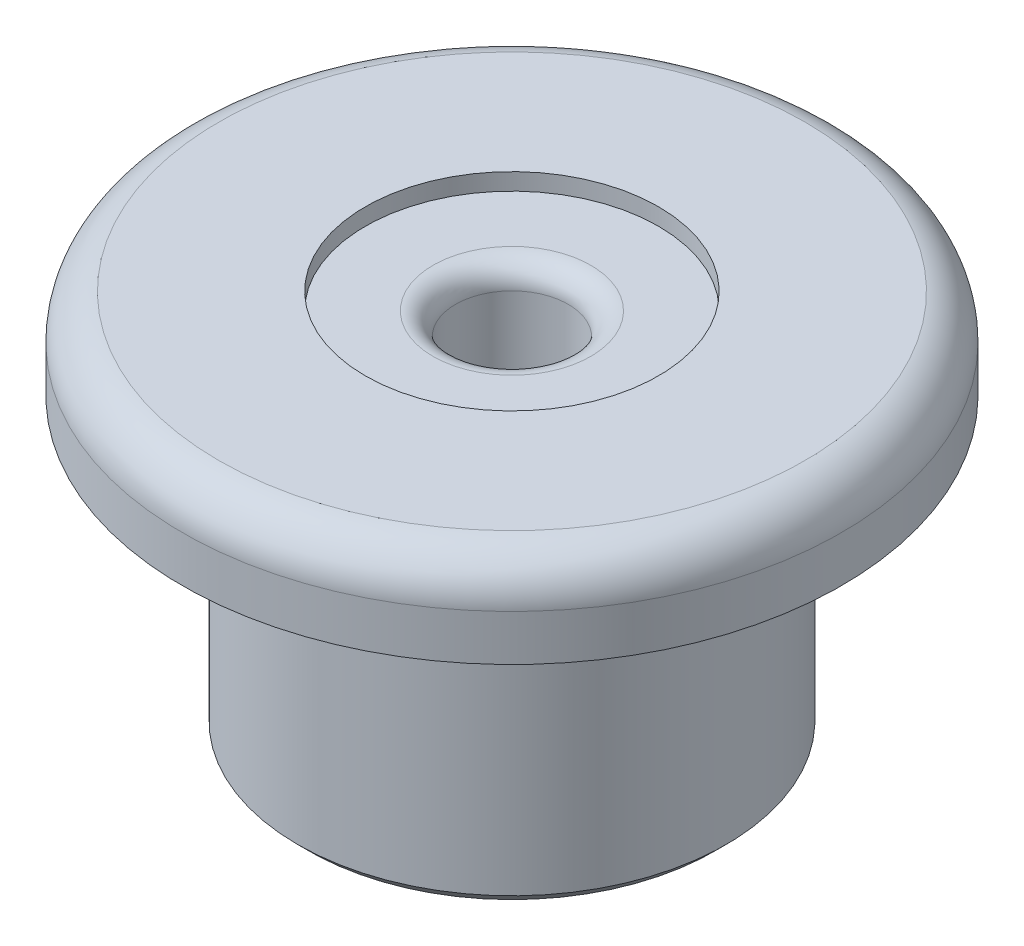
ISO-10303-21;
HEADER;
FILE_DESCRIPTION(('STEP AP214'),'2;1');
FILE_NAME('part.step','',(''),(''),'','','');
FILE_SCHEMA(('AUTOMOTIVE_DESIGN { 1 0 10303 214 1 1 1 1 }'));
ENDSEC;
DATA;
#1=APPLICATION_CONTEXT('core data for automotive mechanical design processes');
#2=APPLICATION_PROTOCOL_DEFINITION('international standard','automotive_design',2000,#1);
#3=PRODUCT_CONTEXT('',#1,'mechanical');
#4=PRODUCT('Part','Part','',(#3));
#5=PRODUCT_RELATED_PRODUCT_CATEGORY('part','',(#4));
#6=PRODUCT_DEFINITION_FORMATION('','',#4);
#7=PRODUCT_DEFINITION_CONTEXT('part definition',#1,'design');
#8=PRODUCT_DEFINITION('design','',#6,#7);
#9=PRODUCT_DEFINITION_SHAPE('','',#8);
#10=(LENGTH_UNIT() NAMED_UNIT(*) SI_UNIT(.MILLI.,.METRE.));
#11=(NAMED_UNIT(*) PLANE_ANGLE_UNIT() SI_UNIT($,.RADIAN.));
#12=(NAMED_UNIT(*) SI_UNIT($,.STERADIAN.) SOLID_ANGLE_UNIT());
#13=UNCERTAINTY_MEASURE_WITH_UNIT(LENGTH_MEASURE(1.E-05),#10,'distance_accuracy_value','');
#14=(GEOMETRIC_REPRESENTATION_CONTEXT(3) GLOBAL_UNCERTAINTY_ASSIGNED_CONTEXT((#13)) GLOBAL_UNIT_ASSIGNED_CONTEXT((#10,
#11,#12)) REPRESENTATION_CONTEXT('',''));
#15=CARTESIAN_POINT('',(0.,0.,0.));
#16=DIRECTION('',(0.,0.,1.));
#17=DIRECTION('',(1.,0.,0.));
#18=AXIS2_PLACEMENT_3D('',#15,#16,#17);
#19=CARTESIAN_POINT('',(0.,1.4,0.));
#20=DIRECTION('',(0.,-1.,0.));
#21=DIRECTION('',(0.,0.,-1.));
#22=AXIS2_PLACEMENT_3D('',#19,#20,#21);
#23=DEGENERATE_TOROIDAL_SURFACE('',#22,1.42376993161939,9.,.F.);
#24=CARTESIAN_POINT('',(0.,1.4,0.));
#25=DIRECTION('',(0.,-1.,0.));
#26=DIRECTION('',(0.,0.,-1.));
#27=AXIS2_PLACEMENT_3D('',#24,#25,#26);
#28=CIRCLE('',#27,7.57623006838061);
#29=CARTESIAN_POINT('',(0.,1.4,-7.57623006838061));
#30=VERTEX_POINT('',#29);
#31=EDGE_CURVE('E78',#30,#30,#28,.T.);
#32=ORIENTED_EDGE('',*,*,#31,.T.);
#33=EDGE_LOOP('',(#32));
#34=FACE_BOUND('',#33,.T.);
#35=CARTESIAN_POINT('',(0.,9.23774582339209,0.));
#36=DIRECTION('',(0.,-1.,0.));
#37=DIRECTION('',(0.,0.,-1.));
#38=AXIS2_PLACEMENT_3D('',#35,#36,#37);
#39=CIRCLE('',#38,3.);
#40=CARTESIAN_POINT('',(0.,9.23774582339209,-3.));
#41=VERTEX_POINT('',#40);
#42=EDGE_CURVE('E57',#41,#41,#39,.F.);
#43=ORIENTED_EDGE('',*,*,#42,.T.);
#44=EDGE_LOOP('',(#43));
#45=FACE_BOUND('',#44,.T.);
#46=ADVANCED_FACE('F33',(#34,#45),#23,.T.);
#47=CARTESIAN_POINT('',(0.,17.,0.));
#48=DIRECTION('',(0.,1.,0.));
#49=DIRECTION('',(0.,0.,1.));
#50=AXIS2_PLACEMENT_3D('',#47,#48,#49);
#51=PLANE('',#50);
#52=CARTESIAN_POINT('',(0.,17.,0.));
#53=DIRECTION('',(0.,1.,0.));
#54=DIRECTION('',(0.,0.,1.));
#55=AXIS2_PLACEMENT_3D('',#52,#53,#54);
#56=CIRCLE('',#55,6.5);
#57=CARTESIAN_POINT('',(0.,17.,6.5));
#58=VERTEX_POINT('',#57);
#59=EDGE_CURVE('E60',#58,#58,#56,.T.);
#60=ORIENTED_EDGE('',*,*,#59,.F.);
#61=EDGE_LOOP('',(#60));
#62=FACE_BOUND('',#61,.T.);
#63=CARTESIAN_POINT('',(0.,17.,0.));
#64=DIRECTION('',(0.,-1.,0.));
#65=DIRECTION('',(0.,0.,-1.));
#66=AXIS2_PLACEMENT_3D('',#63,#64,#65);
#67=CIRCLE('',#66,13.);
#68=CARTESIAN_POINT('',(0.,17.,-13.));
#69=VERTEX_POINT('',#68);
#70=EDGE_CURVE('E56',#69,#69,#67,.T.);
#71=ORIENTED_EDGE('',*,*,#70,.F.);
#72=EDGE_LOOP('',(#71));
#73=FACE_BOUND('',#72,.T.);
#74=ADVANCED_FACE('F96',(#62,#73),#51,.T.);
#75=CARTESIAN_POINT('',(0.,15.0372075540927,0.));
#76=DIRECTION('',(0.,-1.,0.));
#77=DIRECTION('',(0.,0.,-1.));
#78=AXIS2_PLACEMENT_3D('',#75,#76,#77);
#79=TOROIDAL_SURFACE('',#78,12.6160132628734,2.);
#80=ORIENTED_EDGE('',*,*,#70,.T.);
#81=EDGE_LOOP('',(#80));
#82=FACE_BOUND('',#81,.T.);
#83=CARTESIAN_POINT('',(0.,15.0372075540927,0.));
#84=DIRECTION('',(0.,-1.,0.));
#85=DIRECTION('',(0.,0.,-1.));
#86=AXIS2_PLACEMENT_3D('',#83,#84,#85);
#87=CIRCLE('',#86,14.6160132628734);
#88=CARTESIAN_POINT('',(0.,15.0372075540927,-14.6160132628734));
#89=VERTEX_POINT('',#88);
#90=EDGE_CURVE('E66',#89,#89,#87,.T.);
#91=ORIENTED_EDGE('',*,*,#90,.F.);
#92=EDGE_LOOP('',(#91));
#93=FACE_BOUND('',#92,.T.);
#94=ADVANCED_FACE('F99',(#82,#93),#79,.T.);
#95=CARTESIAN_POINT('',(0.,0.,0.));
#96=DIRECTION('',(0.,-1.,0.));
#97=DIRECTION('',(0.,0.,-1.));
#98=AXIS2_PLACEMENT_3D('',#95,#96,#97);
#99=CYLINDRICAL_SURFACE('',#98,14.6160132628734);
#100=ORIENTED_EDGE('',*,*,#90,.T.);
#101=EDGE_LOOP('',(#100));
#102=FACE_BOUND('',#101,.T.);
#103=CARTESIAN_POINT('',(0.,13.,0.));
#104=DIRECTION('',(0.,-1.,0.));
#105=DIRECTION('',(0.,0.,-1.));
#106=AXIS2_PLACEMENT_3D('',#103,#104,#105);
#107=CIRCLE('',#106,14.6160132628734);
#108=CARTESIAN_POINT('',(0.,13.,-14.6160132628734));
#109=VERTEX_POINT('',#108);
#110=EDGE_CURVE('E69',#109,#109,#107,.T.);
#111=ORIENTED_EDGE('',*,*,#110,.F.);
#112=EDGE_LOOP('',(#111));
#113=FACE_BOUND('',#112,.T.);
#114=ADVANCED_FACE('F105',(#102,#113),#99,.T.);
#115=CARTESIAN_POINT('',(14.6160132628734,13.,0.));
#116=DIRECTION('',(0.,-1.,0.));
#117=DIRECTION('',(0.,0.,-1.));
#118=AXIS2_PLACEMENT_3D('',#115,#116,#117);
#119=PLANE('',#118);
#120=ORIENTED_EDGE('',*,*,#110,.T.);
#121=EDGE_LOOP('',(#120));
#122=FACE_BOUND('',#121,.T.);
#123=CARTESIAN_POINT('',(0.,13.,0.));
#124=DIRECTION('',(0.,-1.,0.));
#125=DIRECTION('',(0.,0.,-1.));
#126=AXIS2_PLACEMENT_3D('',#123,#124,#125);
#127=CIRCLE('',#126,9.5);
#128=CARTESIAN_POINT('',(0.,13.,-9.5));
#129=VERTEX_POINT('',#128);
#130=EDGE_CURVE('E72',#129,#129,#127,.T.);
#131=ORIENTED_EDGE('',*,*,#130,.F.);
#132=EDGE_LOOP('',(#131));
#133=FACE_BOUND('',#132,.T.);
#134=ADVANCED_FACE('F111',(#122,#133),#119,.T.);
#135=CARTESIAN_POINT('',(0.,0.,0.));
#136=DIRECTION('',(0.,-1.,0.));
#137=DIRECTION('',(0.,0.,-1.));
#138=AXIS2_PLACEMENT_3D('',#135,#136,#137);
#139=CYLINDRICAL_SURFACE('',#138,9.5);
#140=CARTESIAN_POINT('',(0.,0.500000000000006,0.));
#141=DIRECTION('',(0.,-1.,0.));
#142=DIRECTION('',(0.,0.,-1.));
#143=AXIS2_PLACEMENT_3D('',#140,#141,#142);
#144=CIRCLE('',#143,9.5);
#145=CARTESIAN_POINT('',(0.,0.500000000000006,-9.5));
#146=VERTEX_POINT('',#145);
#147=EDGE_CURVE('E48',#146,#146,#144,.F.);
#148=ORIENTED_EDGE('',*,*,#147,.T.);
#149=EDGE_LOOP('',(#148));
#150=FACE_BOUND('',#149,.T.);
#151=ORIENTED_EDGE('',*,*,#130,.T.);
#152=EDGE_LOOP('',(#151));
#153=FACE_BOUND('',#152,.T.);
#154=ADVANCED_FACE('F117',(#150,#153),#139,.T.);
#155=CARTESIAN_POINT('',(9.5,0.,0.));
#156=DIRECTION('',(0.,-1.,0.));
#157=DIRECTION('',(0.,0.,-1.));
#158=AXIS2_PLACEMENT_3D('',#155,#156,#157);
#159=PLANE('',#158);
#160=CARTESIAN_POINT('',(0.,0.,0.));
#161=DIRECTION('',(0.,-1.,0.));
#162=DIRECTION('',(0.,0.,-1.));
#163=AXIS2_PLACEMENT_3D('',#160,#161,#162);
#164=CIRCLE('',#163,9.);
#165=CARTESIAN_POINT('',(0.,0.,-9.));
#166=VERTEX_POINT('',#165);
#167=EDGE_CURVE('E53',#166,#166,#164,.T.);
#168=ORIENTED_EDGE('',*,*,#167,.T.);
#169=EDGE_LOOP('',(#168));
#170=FACE_BOUND('',#169,.T.);
#171=CARTESIAN_POINT('',(0.,0.,0.));
#172=DIRECTION('',(0.,-1.,0.));
#173=DIRECTION('',(0.,0.,-1.));
#174=AXIS2_PLACEMENT_3D('',#171,#172,#173);
#175=CIRCLE('',#174,7.57623006838061);
#176=CARTESIAN_POINT('',(0.,0.,-7.57623006838061));
#177=VERTEX_POINT('',#176);
#178=EDGE_CURVE('E75',#177,#177,#175,.T.);
#179=ORIENTED_EDGE('',*,*,#178,.F.);
#180=EDGE_LOOP('',(#179));
#181=FACE_BOUND('',#180,.T.);
#182=ADVANCED_FACE('F122',(#170,#181),#159,.T.);
#183=CARTESIAN_POINT('',(0.,0.,0.));
#184=DIRECTION('',(0.,-1.,0.));
#185=DIRECTION('',(0.,0.,-1.));
#186=AXIS2_PLACEMENT_3D('',#183,#184,#185);
#187=CYLINDRICAL_SURFACE('',#186,7.57623006838061);
#188=ORIENTED_EDGE('',*,*,#178,.T.);
#189=EDGE_LOOP('',(#188));
#190=FACE_BOUND('',#189,.T.);
#191=ORIENTED_EDGE('',*,*,#31,.F.);
#192=EDGE_LOOP('',(#191));
#193=FACE_BOUND('',#192,.T.);
#194=ADVANCED_FACE('F92',(#190,#193),#187,.F.);
#195=CARTESIAN_POINT('',(0.,16.25,0.));
#196=DIRECTION('',(0.,1.,0.));
#197=DIRECTION('',(0.,0.,1.));
#198=AXIS2_PLACEMENT_3D('',#195,#196,#197);
#199=CYLINDRICAL_SURFACE('',#198,6.5);
#200=CARTESIAN_POINT('',(0.,16.25,0.));
#201=DIRECTION('',(0.,1.,0.));
#202=DIRECTION('',(0.,0.,1.));
#203=AXIS2_PLACEMENT_3D('',#200,#201,#202);
#204=CIRCLE('',#203,6.5);
#205=CARTESIAN_POINT('',(0.,16.25,6.5));
#206=VERTEX_POINT('',#205);
#207=EDGE_CURVE('E81',#206,#206,#204,.T.);
#208=ORIENTED_EDGE('',*,*,#207,.F.);
#209=EDGE_LOOP('',(#208));
#210=FACE_BOUND('',#209,.T.);
#211=ORIENTED_EDGE('',*,*,#59,.T.);
#212=EDGE_LOOP('',(#211));
#213=FACE_BOUND('',#212,.T.);
#214=ADVANCED_FACE('F89',(#210,#213),#199,.F.);
#215=CARTESIAN_POINT('',(0.,16.25,0.));
#216=DIRECTION('',(0.,1.,0.));
#217=DIRECTION('',(0.,0.,1.));
#218=AXIS2_PLACEMENT_3D('',#215,#216,#217);
#219=PLANE('',#218);
#220=CARTESIAN_POINT('',(0.,16.25,0.));
#221=DIRECTION('',(0.,1.,0.));
#222=DIRECTION('',(0.,0.,1.));
#223=AXIS2_PLACEMENT_3D('',#220,#221,#222);
#224=CIRCLE('',#223,3.5);
#225=CARTESIAN_POINT('',(0.,16.25,3.5));
#226=VERTEX_POINT('',#225);
#227=EDGE_CURVE('E40',#226,#226,#224,.F.);
#228=ORIENTED_EDGE('',*,*,#227,.T.);
#229=EDGE_LOOP('',(#228));
#230=FACE_BOUND('',#229,.T.);
#231=ORIENTED_EDGE('',*,*,#207,.T.);
#232=EDGE_LOOP('',(#231));
#233=FACE_BOUND('',#232,.T.);
#234=ADVANCED_FACE('F87',(#230,#233),#219,.T.);
#235=CARTESIAN_POINT('',(0.,-49.5,0.));
#236=DIRECTION('',(0.,1.,0.));
#237=DIRECTION('',(0.,0.,1.));
#238=AXIS2_PLACEMENT_3D('',#235,#236,#237);
#239=CYLINDRICAL_SURFACE('',#238,2.5);
#240=CARTESIAN_POINT('',(0.,15.25,0.));
#241=DIRECTION('',(0.,1.,0.));
#242=DIRECTION('',(0.,0.,1.));
#243=AXIS2_PLACEMENT_3D('',#240,#241,#242);
#244=CIRCLE('',#243,2.5);
#245=CARTESIAN_POINT('',(0.,15.25,2.5));
#246=VERTEX_POINT('',#245);
#247=EDGE_CURVE('E44',#246,#246,#244,.T.);
#248=ORIENTED_EDGE('',*,*,#247,.T.);
#249=EDGE_LOOP('',(#248));
#250=FACE_BOUND('',#249,.T.);
#251=CARTESIAN_POINT('',(0.,11.,0.));
#252=DIRECTION('',(0.,1.,0.));
#253=DIRECTION('',(0.,0.,1.));
#254=AXIS2_PLACEMENT_3D('',#251,#252,#253);
#255=CIRCLE('',#254,2.5);
#256=CARTESIAN_POINT('',(0.,11.,2.5));
#257=VERTEX_POINT('',#256);
#258=EDGE_CURVE('E61',#257,#257,#255,.F.);
#259=ORIENTED_EDGE('',*,*,#258,.T.);
#260=EDGE_LOOP('',(#259));
#261=FACE_BOUND('',#260,.T.);
#262=ADVANCED_FACE('F160',(#250,#261),#239,.F.);
#263=CARTESIAN_POINT('',(0.,11.,0.));
#264=DIRECTION('',(0.,-1.,0.));
#265=DIRECTION('',(0.,0.,-1.));
#266=AXIS2_PLACEMENT_3D('',#263,#264,#265);
#267=CYLINDRICAL_SURFACE('',#266,3.);
#268=CARTESIAN_POINT('',(0.,10.1339745962156,0.));
#269=DIRECTION('',(0.,1.,0.));
#270=DIRECTION('',(0.,0.,1.));
#271=AXIS2_PLACEMENT_3D('',#268,#269,#270);
#272=CIRCLE('',#271,3.);
#273=CARTESIAN_POINT('',(0.,10.1339745962156,3.));
#274=VERTEX_POINT('',#273);
#275=EDGE_CURVE('E10',#274,#274,#272,.T.);
#276=ORIENTED_EDGE('',*,*,#275,.T.);
#277=EDGE_LOOP('',(#276));
#278=FACE_BOUND('',#277,.T.);
#279=ORIENTED_EDGE('',*,*,#42,.F.);
#280=EDGE_LOOP('',(#279));
#281=FACE_BOUND('',#280,.T.);
#282=ADVANCED_FACE('F167',(#278,#281),#267,.F.);
#283=CARTESIAN_POINT('',(0.,0.,0.));
#284=DIRECTION('',(0.,1.,0.));
#285=DIRECTION('',(0.,0.,1.));
#286=AXIS2_PLACEMENT_3D('',#283,#284,#285);
#287=CONICAL_SURFACE('',#286,9.,0.785398163397443);
#288=ORIENTED_EDGE('',*,*,#147,.F.);
#289=EDGE_LOOP('',(#288));
#290=FACE_BOUND('',#289,.T.);
#291=ORIENTED_EDGE('',*,*,#167,.F.);
#292=EDGE_LOOP('',(#291));
#293=FACE_BOUND('',#292,.T.);
#294=ADVANCED_FACE('F175',(#290,#293),#287,.T.);
#295=CARTESIAN_POINT('',(0.,15.25,0.));
#296=DIRECTION('',(0.,1.,0.));
#297=DIRECTION('',(0.,0.,1.));
#298=AXIS2_PLACEMENT_3D('',#295,#296,#297);
#299=TOROIDAL_SURFACE('',#298,3.5,1.);
#300=ORIENTED_EDGE('',*,*,#227,.F.);
#301=EDGE_LOOP('',(#300));
#302=FACE_BOUND('',#301,.T.);
#303=ORIENTED_EDGE('',*,*,#247,.F.);
#304=EDGE_LOOP('',(#303));
#305=FACE_BOUND('',#304,.T.);
#306=ADVANCED_FACE('F182',(#302,#305),#299,.T.);
#307=CARTESIAN_POINT('',(0.,10.1339745962156,0.));
#308=DIRECTION('',(0.,1.,0.));
#309=DIRECTION('',(0.,0.,1.));
#310=AXIS2_PLACEMENT_3D('',#307,#308,#309);
#311=TOROIDAL_SURFACE('',#310,2.,1.);
#312=ORIENTED_EDGE('',*,*,#258,.F.);
#313=EDGE_LOOP('',(#312));
#314=FACE_BOUND('',#313,.T.);
#315=ORIENTED_EDGE('',*,*,#275,.F.);
#316=EDGE_LOOP('',(#315));
#317=FACE_BOUND('',#316,.T.);
#318=ADVANCED_FACE('F35',(#314,#317),#311,.F.);
#319=CLOSED_SHELL('',(#46,#74,#94,#114,#134,#154,#182,#194,#214,#234,#262,#282,#294,#306,#318));
#320=MANIFOLD_SOLID_BREP('B2',#319);
#321=ADVANCED_BREP_SHAPE_REPRESENTATION('',(#18,#320),#14);
#322=SHAPE_DEFINITION_REPRESENTATION(#9,#321);
ENDSEC;
END-ISO-10303-21;
